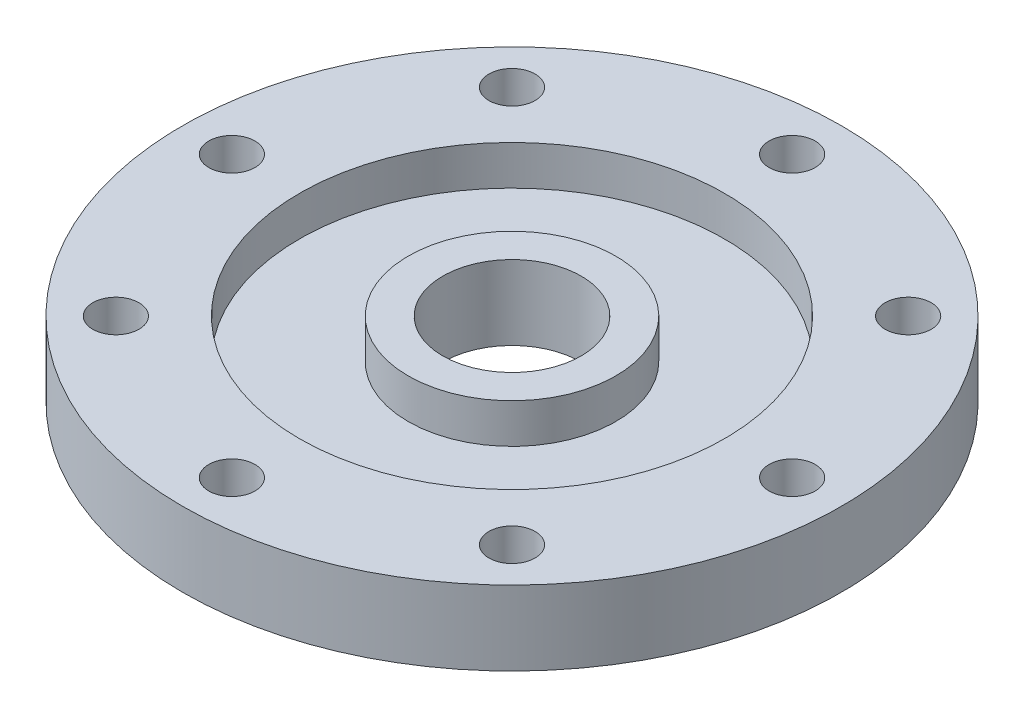
ISO-10303-21;
HEADER;
FILE_DESCRIPTION(('STEP AP214'),'2;1');
FILE_NAME('part.step','',(''),(''),'','','');
FILE_SCHEMA(('AUTOMOTIVE_DESIGN { 1 0 10303 214 1 1 1 1 }'));
ENDSEC;
DATA;
#1=APPLICATION_CONTEXT('core data for automotive mechanical design processes');
#2=APPLICATION_PROTOCOL_DEFINITION('international standard','automotive_design',2000,#1);
#3=PRODUCT_CONTEXT('',#1,'mechanical');
#4=PRODUCT('Part','Part','',(#3));
#5=PRODUCT_RELATED_PRODUCT_CATEGORY('part','',(#4));
#6=PRODUCT_DEFINITION_FORMATION('','',#4);
#7=PRODUCT_DEFINITION_CONTEXT('part definition',#1,'design');
#8=PRODUCT_DEFINITION('design','',#6,#7);
#9=PRODUCT_DEFINITION_SHAPE('','',#8);
#10=(LENGTH_UNIT() NAMED_UNIT(*) SI_UNIT(.MILLI.,.METRE.));
#11=(NAMED_UNIT(*) PLANE_ANGLE_UNIT() SI_UNIT($,.RADIAN.));
#12=(NAMED_UNIT(*) SI_UNIT($,.STERADIAN.) SOLID_ANGLE_UNIT());
#13=UNCERTAINTY_MEASURE_WITH_UNIT(LENGTH_MEASURE(1.E-05),#10,'distance_accuracy_value','');
#14=(GEOMETRIC_REPRESENTATION_CONTEXT(3) GLOBAL_UNCERTAINTY_ASSIGNED_CONTEXT((#13)) GLOBAL_UNIT_ASSIGNED_CONTEXT((#10,
#11,#12)) REPRESENTATION_CONTEXT('',''));
#15=CARTESIAN_POINT('',(0.,0.,0.));
#16=DIRECTION('',(0.,0.,1.));
#17=DIRECTION('',(1.,0.,0.));
#18=AXIS2_PLACEMENT_3D('',#15,#16,#17);
#19=CARTESIAN_POINT('',(0.,2.825,0.));
#20=DIRECTION('',(0.,1.,0.));
#21=DIRECTION('',(0.,0.,1.));
#22=AXIS2_PLACEMENT_3D('',#19,#20,#21);
#23=PLANE('',#22);
#24=CARTESIAN_POINT('',(0.,2.825,0.));
#25=DIRECTION('',(0.,1.,0.));
#26=DIRECTION('',(0.,0.,1.));
#27=AXIS2_PLACEMENT_3D('',#24,#25,#26);
#28=CIRCLE('',#27,5.25);
#29=CARTESIAN_POINT('',(0.,2.825,5.25));
#30=VERTEX_POINT('',#29);
#31=EDGE_CURVE('E44',#30,#30,#28,.T.);
#32=ORIENTED_EDGE('',*,*,#31,.F.);
#33=EDGE_LOOP('',(#32));
#34=FACE_BOUND('',#33,.T.);
#35=CARTESIAN_POINT('',(0.,2.825,0.));
#36=DIRECTION('',(0.,1.,0.));
#37=DIRECTION('',(0.,0.,1.));
#38=AXIS2_PLACEMENT_3D('',#35,#36,#37);
#39=CIRCLE('',#38,7.875);
#40=CARTESIAN_POINT('',(0.,2.825,7.875));
#41=VERTEX_POINT('',#40);
#42=EDGE_CURVE('E106',#41,#41,#39,.T.);
#43=ORIENTED_EDGE('',*,*,#42,.T.);
#44=EDGE_LOOP('',(#43));
#45=FACE_BOUND('',#44,.T.);
#46=ADVANCED_FACE('F33',(#34,#45),#23,.T.);
#47=CARTESIAN_POINT('',(0.,2.825,0.));
#48=DIRECTION('',(0.,1.,0.));
#49=DIRECTION('',(0.,0.,1.));
#50=AXIS2_PLACEMENT_3D('',#47,#48,#49);
#51=CIRCLE('',#50,16.125);
#52=CARTESIAN_POINT('',(0.,2.825,16.125));
#53=VERTEX_POINT('',#52);
#54=EDGE_CURVE('E100',#53,#53,#51,.T.);
#55=ORIENTED_EDGE('',*,*,#54,.F.);
#56=EDGE_LOOP('',(#55));
#57=FACE_BOUND('',#56,.T.);
#58=CARTESIAN_POINT('',(-21.25,2.825,0.));
#59=DIRECTION('',(0.,1.,0.));
#60=DIRECTION('',(0.,0.,1.));
#61=AXIS2_PLACEMENT_3D('',#58,#59,#60);
#62=CIRCLE('',#61,1.75);
#63=CARTESIAN_POINT('',(-21.25,2.825,1.75));
#64=VERTEX_POINT('',#63);
#65=EDGE_CURVE('E85',#64,#64,#62,.T.);
#66=ORIENTED_EDGE('',*,*,#65,.F.);
#67=EDGE_LOOP('',(#66));
#68=FACE_BOUND('',#67,.T.);
#69=CARTESIAN_POINT('',(0.,2.825,21.25));
#70=DIRECTION('',(0.,1.,0.));
#71=DIRECTION('',(0.,0.,1.));
#72=AXIS2_PLACEMENT_3D('',#69,#70,#71);
#73=CIRCLE('',#72,1.75);
#74=CARTESIAN_POINT('',(0.,2.825,23.));
#75=VERTEX_POINT('',#74);
#76=EDGE_CURVE('E73',#75,#75,#73,.T.);
#77=ORIENTED_EDGE('',*,*,#76,.F.);
#78=EDGE_LOOP('',(#77));
#79=FACE_BOUND('',#78,.T.);
#80=CARTESIAN_POINT('',(21.25,2.825,0.));
#81=DIRECTION('',(0.,1.,0.));
#82=DIRECTION('',(0.,0.,1.));
#83=AXIS2_PLACEMENT_3D('',#80,#81,#82);
#84=CIRCLE('',#83,1.75);
#85=CARTESIAN_POINT('',(21.25,2.825,1.75));
#86=VERTEX_POINT('',#85);
#87=EDGE_CURVE('E61',#86,#86,#84,.T.);
#88=ORIENTED_EDGE('',*,*,#87,.F.);
#89=EDGE_LOOP('',(#88));
#90=FACE_BOUND('',#89,.T.);
#91=CARTESIAN_POINT('',(15.0260191002147,2.825,-15.0260191002141));
#92=DIRECTION('',(0.,1.,0.));
#93=DIRECTION('',(0.,0.,1.));
#94=AXIS2_PLACEMENT_3D('',#91,#92,#93);
#95=CIRCLE('',#94,1.75);
#96=CARTESIAN_POINT('',(15.0260191002147,2.825,-13.2760191002141));
#97=VERTEX_POINT('',#96);
#98=EDGE_CURVE('E49',#97,#97,#95,.T.);
#99=ORIENTED_EDGE('',*,*,#98,.F.);
#100=EDGE_LOOP('',(#99));
#101=FACE_BOUND('',#100,.T.);
#102=CARTESIAN_POINT('',(0.,2.825,0.));
#103=DIRECTION('',(0.,1.,0.));
#104=DIRECTION('',(0.,0.,1.));
#105=AXIS2_PLACEMENT_3D('',#102,#103,#104);
#106=CIRCLE('',#105,25.);
#107=CARTESIAN_POINT('',(0.,2.825,25.));
#108=VERTEX_POINT('',#107);
#109=EDGE_CURVE('E10',#108,#108,#106,.T.);
#110=ORIENTED_EDGE('',*,*,#109,.T.);
#111=EDGE_LOOP('',(#110));
#112=FACE_BOUND('',#111,.T.);
#113=CARTESIAN_POINT('',(0.,2.825,-21.25));
#114=DIRECTION('',(0.,1.,0.));
#115=DIRECTION('',(0.,0.,1.));
#116=AXIS2_PLACEMENT_3D('',#113,#114,#115);
#117=CIRCLE('',#116,1.75);
#118=CARTESIAN_POINT('',(0.,2.825,-19.5));
#119=VERTEX_POINT('',#118);
#120=EDGE_CURVE('E55',#119,#119,#117,.T.);
#121=ORIENTED_EDGE('',*,*,#120,.F.);
#122=EDGE_LOOP('',(#121));
#123=FACE_BOUND('',#122,.T.);
#124=CARTESIAN_POINT('',(15.0260191002141,2.825,15.0260191002141));
#125=DIRECTION('',(0.,1.,0.));
#126=DIRECTION('',(0.,0.,1.));
#127=AXIS2_PLACEMENT_3D('',#124,#125,#126);
#128=CIRCLE('',#127,1.75);
#129=CARTESIAN_POINT('',(15.0260191002141,2.825,16.7760191002141));
#130=VERTEX_POINT('',#129);
#131=EDGE_CURVE('E67',#130,#130,#128,.T.);
#132=ORIENTED_EDGE('',*,*,#131,.F.);
#133=EDGE_LOOP('',(#132));
#134=FACE_BOUND('',#133,.T.);
#135=CARTESIAN_POINT('',(-15.0260191002141,2.825,15.0260191002141));
#136=DIRECTION('',(0.,1.,0.));
#137=DIRECTION('',(0.,0.,1.));
#138=AXIS2_PLACEMENT_3D('',#135,#136,#137);
#139=CIRCLE('',#138,1.75);
#140=CARTESIAN_POINT('',(-15.0260191002141,2.825,16.7760191002141));
#141=VERTEX_POINT('',#140);
#142=EDGE_CURVE('E79',#141,#141,#139,.T.);
#143=ORIENTED_EDGE('',*,*,#142,.F.);
#144=EDGE_LOOP('',(#143));
#145=FACE_BOUND('',#144,.T.);
#146=CARTESIAN_POINT('',(-15.0260191002145,2.825,-15.0260191002138));
#147=DIRECTION('',(0.,1.,0.));
#148=DIRECTION('',(0.,0.,1.));
#149=AXIS2_PLACEMENT_3D('',#146,#147,#148);
#150=CIRCLE('',#149,1.75);
#151=CARTESIAN_POINT('',(-15.0260191002145,2.825,-13.2760191002138));
#152=VERTEX_POINT('',#151);
#153=EDGE_CURVE('E91',#152,#152,#150,.T.);
#154=ORIENTED_EDGE('',*,*,#153,.F.);
#155=EDGE_LOOP('',(#154));
#156=FACE_BOUND('',#155,.T.);
#157=ADVANCED_FACE('F128',(#57,#68,#79,#90,#101,#112,#123,#134,#145,#156),#23,.T.);
#158=CARTESIAN_POINT('',(0.,-2.825,0.));
#159=DIRECTION('',(0.,1.,0.));
#160=DIRECTION('',(0.,0.,1.));
#161=AXIS2_PLACEMENT_3D('',#158,#159,#160);
#162=PLANE('',#161);
#163=CARTESIAN_POINT('',(0.,-2.825,0.));
#164=DIRECTION('',(0.,1.,0.));
#165=DIRECTION('',(0.,0.,1.));
#166=AXIS2_PLACEMENT_3D('',#163,#164,#165);
#167=CIRCLE('',#166,25.);
#168=CARTESIAN_POINT('',(0.,-2.825,25.));
#169=VERTEX_POINT('',#168);
#170=EDGE_CURVE('E37',#169,#169,#167,.T.);
#171=ORIENTED_EDGE('',*,*,#170,.F.);
#172=EDGE_LOOP('',(#171));
#173=FACE_BOUND('',#172,.T.);
#174=CARTESIAN_POINT('',(0.,-2.825,0.));
#175=DIRECTION('',(0.,1.,0.));
#176=DIRECTION('',(0.,0.,1.));
#177=AXIS2_PLACEMENT_3D('',#174,#175,#176);
#178=CIRCLE('',#177,5.25);
#179=CARTESIAN_POINT('',(0.,-2.825,5.25));
#180=VERTEX_POINT('',#179);
#181=EDGE_CURVE('E46',#180,#180,#178,.T.);
#182=ORIENTED_EDGE('',*,*,#181,.T.);
#183=EDGE_LOOP('',(#182));
#184=FACE_BOUND('',#183,.T.);
#185=CARTESIAN_POINT('',(15.0260191002147,-2.825,-15.0260191002141));
#186=DIRECTION('',(0.,1.,0.));
#187=DIRECTION('',(0.,0.,1.));
#188=AXIS2_PLACEMENT_3D('',#185,#186,#187);
#189=CIRCLE('',#188,1.75);
#190=CARTESIAN_POINT('',(15.0260191002147,-2.825,-13.2760191002141));
#191=VERTEX_POINT('',#190);
#192=EDGE_CURVE('E52',#191,#191,#189,.T.);
#193=ORIENTED_EDGE('',*,*,#192,.T.);
#194=EDGE_LOOP('',(#193));
#195=FACE_BOUND('',#194,.T.);
#196=CARTESIAN_POINT('',(0.,-2.825,-21.25));
#197=DIRECTION('',(0.,1.,0.));
#198=DIRECTION('',(0.,0.,1.));
#199=AXIS2_PLACEMENT_3D('',#196,#197,#198);
#200=CIRCLE('',#199,1.75);
#201=CARTESIAN_POINT('',(0.,-2.825,-19.5));
#202=VERTEX_POINT('',#201);
#203=EDGE_CURVE('E58',#202,#202,#200,.T.);
#204=ORIENTED_EDGE('',*,*,#203,.T.);
#205=EDGE_LOOP('',(#204));
#206=FACE_BOUND('',#205,.T.);
#207=CARTESIAN_POINT('',(21.25,-2.825,0.));
#208=DIRECTION('',(0.,1.,0.));
#209=DIRECTION('',(0.,0.,1.));
#210=AXIS2_PLACEMENT_3D('',#207,#208,#209);
#211=CIRCLE('',#210,1.75);
#212=CARTESIAN_POINT('',(21.25,-2.825,1.75));
#213=VERTEX_POINT('',#212);
#214=EDGE_CURVE('E64',#213,#213,#211,.T.);
#215=ORIENTED_EDGE('',*,*,#214,.T.);
#216=EDGE_LOOP('',(#215));
#217=FACE_BOUND('',#216,.T.);
#218=CARTESIAN_POINT('',(15.0260191002141,-2.825,15.0260191002141));
#219=DIRECTION('',(0.,1.,0.));
#220=DIRECTION('',(0.,0.,1.));
#221=AXIS2_PLACEMENT_3D('',#218,#219,#220);
#222=CIRCLE('',#221,1.75);
#223=CARTESIAN_POINT('',(15.0260191002141,-2.825,16.7760191002141));
#224=VERTEX_POINT('',#223);
#225=EDGE_CURVE('E70',#224,#224,#222,.T.);
#226=ORIENTED_EDGE('',*,*,#225,.T.);
#227=EDGE_LOOP('',(#226));
#228=FACE_BOUND('',#227,.T.);
#229=CARTESIAN_POINT('',(0.,-2.825,21.25));
#230=DIRECTION('',(0.,1.,0.));
#231=DIRECTION('',(0.,0.,1.));
#232=AXIS2_PLACEMENT_3D('',#229,#230,#231);
#233=CIRCLE('',#232,1.75);
#234=CARTESIAN_POINT('',(0.,-2.825,23.));
#235=VERTEX_POINT('',#234);
#236=EDGE_CURVE('E76',#235,#235,#233,.T.);
#237=ORIENTED_EDGE('',*,*,#236,.T.);
#238=EDGE_LOOP('',(#237));
#239=FACE_BOUND('',#238,.T.);
#240=CARTESIAN_POINT('',(-15.0260191002141,-2.825,15.0260191002141));
#241=DIRECTION('',(0.,1.,0.));
#242=DIRECTION('',(0.,0.,1.));
#243=AXIS2_PLACEMENT_3D('',#240,#241,#242);
#244=CIRCLE('',#243,1.75);
#245=CARTESIAN_POINT('',(-15.0260191002141,-2.825,16.7760191002141));
#246=VERTEX_POINT('',#245);
#247=EDGE_CURVE('E82',#246,#246,#244,.T.);
#248=ORIENTED_EDGE('',*,*,#247,.T.);
#249=EDGE_LOOP('',(#248));
#250=FACE_BOUND('',#249,.T.);
#251=CARTESIAN_POINT('',(-21.25,-2.825,0.));
#252=DIRECTION('',(0.,1.,0.));
#253=DIRECTION('',(0.,0.,1.));
#254=AXIS2_PLACEMENT_3D('',#251,#252,#253);
#255=CIRCLE('',#254,1.75);
#256=CARTESIAN_POINT('',(-21.25,-2.825,1.75));
#257=VERTEX_POINT('',#256);
#258=EDGE_CURVE('E88',#257,#257,#255,.T.);
#259=ORIENTED_EDGE('',*,*,#258,.T.);
#260=EDGE_LOOP('',(#259));
#261=FACE_BOUND('',#260,.T.);
#262=CARTESIAN_POINT('',(-15.0260191002145,-2.825,-15.0260191002138));
#263=DIRECTION('',(0.,1.,0.));
#264=DIRECTION('',(0.,0.,1.));
#265=AXIS2_PLACEMENT_3D('',#262,#263,#264);
#266=CIRCLE('',#265,1.75);
#267=CARTESIAN_POINT('',(-15.0260191002145,-2.825,-13.2760191002138));
#268=VERTEX_POINT('',#267);
#269=EDGE_CURVE('E94',#268,#268,#266,.T.);
#270=ORIENTED_EDGE('',*,*,#269,.T.);
#271=EDGE_LOOP('',(#270));
#272=FACE_BOUND('',#271,.T.);
#273=ADVANCED_FACE('F131',(#173,#184,#195,#206,#217,#228,#239,#250,#261,#272),#162,.F.);
#274=CARTESIAN_POINT('',(0.,2.825,0.));
#275=DIRECTION('',(0.,-1.,0.));
#276=DIRECTION('',(0.,0.,-1.));
#277=AXIS2_PLACEMENT_3D('',#274,#275,#276);
#278=CYLINDRICAL_SURFACE('',#277,25.);
#279=ORIENTED_EDGE('',*,*,#109,.F.);
#280=EDGE_LOOP('',(#279));
#281=FACE_BOUND('',#280,.T.);
#282=ORIENTED_EDGE('',*,*,#170,.T.);
#283=EDGE_LOOP('',(#282));
#284=FACE_BOUND('',#283,.T.);
#285=ADVANCED_FACE('F35',(#281,#284),#278,.T.);
#286=CARTESIAN_POINT('',(0.,2.825,0.));
#287=DIRECTION('',(0.,-1.,0.));
#288=DIRECTION('',(0.,0.,-1.));
#289=AXIS2_PLACEMENT_3D('',#286,#287,#288);
#290=CYLINDRICAL_SURFACE('',#289,5.25);
#291=ORIENTED_EDGE('',*,*,#31,.T.);
#292=EDGE_LOOP('',(#291));
#293=FACE_BOUND('',#292,.T.);
#294=ORIENTED_EDGE('',*,*,#181,.F.);
#295=EDGE_LOOP('',(#294));
#296=FACE_BOUND('',#295,.T.);
#297=ADVANCED_FACE('F160',(#293,#296),#290,.F.);
#298=CARTESIAN_POINT('',(15.0260191002147,2.825,-15.0260191002141));
#299=DIRECTION('',(0.,-1.,0.));
#300=DIRECTION('',(0.,0.,-1.));
#301=AXIS2_PLACEMENT_3D('',#298,#299,#300);
#302=CYLINDRICAL_SURFACE('',#301,1.75);
#303=ORIENTED_EDGE('',*,*,#98,.T.);
#304=EDGE_LOOP('',(#303));
#305=FACE_BOUND('',#304,.T.);
#306=ORIENTED_EDGE('',*,*,#192,.F.);
#307=EDGE_LOOP('',(#306));
#308=FACE_BOUND('',#307,.T.);
#309=ADVANCED_FACE('F173',(#305,#308),#302,.F.);
#310=CARTESIAN_POINT('',(0.,2.825,-21.25));
#311=DIRECTION('',(0.,-1.,0.));
#312=DIRECTION('',(0.,0.,-1.));
#313=AXIS2_PLACEMENT_3D('',#310,#311,#312);
#314=CYLINDRICAL_SURFACE('',#313,1.75);
#315=ORIENTED_EDGE('',*,*,#120,.T.);
#316=EDGE_LOOP('',(#315));
#317=FACE_BOUND('',#316,.T.);
#318=ORIENTED_EDGE('',*,*,#203,.F.);
#319=EDGE_LOOP('',(#318));
#320=FACE_BOUND('',#319,.T.);
#321=ADVANCED_FACE('F177',(#317,#320),#314,.F.);
#322=CARTESIAN_POINT('',(21.25,2.825,0.));
#323=DIRECTION('',(0.,-1.,0.));
#324=DIRECTION('',(0.,0.,-1.));
#325=AXIS2_PLACEMENT_3D('',#322,#323,#324);
#326=CYLINDRICAL_SURFACE('',#325,1.75);
#327=ORIENTED_EDGE('',*,*,#87,.T.);
#328=EDGE_LOOP('',(#327));
#329=FACE_BOUND('',#328,.T.);
#330=ORIENTED_EDGE('',*,*,#214,.F.);
#331=EDGE_LOOP('',(#330));
#332=FACE_BOUND('',#331,.T.);
#333=ADVANCED_FACE('F181',(#329,#332),#326,.F.);
#334=CARTESIAN_POINT('',(15.0260191002141,2.825,15.0260191002141));
#335=DIRECTION('',(0.,-1.,0.));
#336=DIRECTION('',(0.,0.,-1.));
#337=AXIS2_PLACEMENT_3D('',#334,#335,#336);
#338=CYLINDRICAL_SURFACE('',#337,1.75);
#339=ORIENTED_EDGE('',*,*,#131,.T.);
#340=EDGE_LOOP('',(#339));
#341=FACE_BOUND('',#340,.T.);
#342=ORIENTED_EDGE('',*,*,#225,.F.);
#343=EDGE_LOOP('',(#342));
#344=FACE_BOUND('',#343,.T.);
#345=ADVANCED_FACE('F185',(#341,#344),#338,.F.);
#346=CARTESIAN_POINT('',(0.,2.825,21.25));
#347=DIRECTION('',(0.,-1.,0.));
#348=DIRECTION('',(0.,0.,-1.));
#349=AXIS2_PLACEMENT_3D('',#346,#347,#348);
#350=CYLINDRICAL_SURFACE('',#349,1.75);
#351=ORIENTED_EDGE('',*,*,#76,.T.);
#352=EDGE_LOOP('',(#351));
#353=FACE_BOUND('',#352,.T.);
#354=ORIENTED_EDGE('',*,*,#236,.F.);
#355=EDGE_LOOP('',(#354));
#356=FACE_BOUND('',#355,.T.);
#357=ADVANCED_FACE('F189',(#353,#356),#350,.F.);
#358=CARTESIAN_POINT('',(-15.0260191002141,2.825,15.0260191002141));
#359=DIRECTION('',(0.,-1.,0.));
#360=DIRECTION('',(0.,0.,-1.));
#361=AXIS2_PLACEMENT_3D('',#358,#359,#360);
#362=CYLINDRICAL_SURFACE('',#361,1.75);
#363=ORIENTED_EDGE('',*,*,#142,.T.);
#364=EDGE_LOOP('',(#363));
#365=FACE_BOUND('',#364,.T.);
#366=ORIENTED_EDGE('',*,*,#247,.F.);
#367=EDGE_LOOP('',(#366));
#368=FACE_BOUND('',#367,.T.);
#369=ADVANCED_FACE('F193',(#365,#368),#362,.F.);
#370=CARTESIAN_POINT('',(-21.25,2.825,0.));
#371=DIRECTION('',(0.,-1.,0.));
#372=DIRECTION('',(0.,0.,-1.));
#373=AXIS2_PLACEMENT_3D('',#370,#371,#372);
#374=CYLINDRICAL_SURFACE('',#373,1.75);
#375=ORIENTED_EDGE('',*,*,#65,.T.);
#376=EDGE_LOOP('',(#375));
#377=FACE_BOUND('',#376,.T.);
#378=ORIENTED_EDGE('',*,*,#258,.F.);
#379=EDGE_LOOP('',(#378));
#380=FACE_BOUND('',#379,.T.);
#381=ADVANCED_FACE('F151',(#377,#380),#374,.F.);
#382=CARTESIAN_POINT('',(-15.0260191002145,2.825,-15.0260191002138));
#383=DIRECTION('',(0.,-1.,0.));
#384=DIRECTION('',(0.,0.,-1.));
#385=AXIS2_PLACEMENT_3D('',#382,#383,#384);
#386=CYLINDRICAL_SURFACE('',#385,1.75);
#387=ORIENTED_EDGE('',*,*,#153,.T.);
#388=EDGE_LOOP('',(#387));
#389=FACE_BOUND('',#388,.T.);
#390=ORIENTED_EDGE('',*,*,#269,.F.);
#391=EDGE_LOOP('',(#390));
#392=FACE_BOUND('',#391,.T.);
#393=ADVANCED_FACE('F124',(#389,#392),#386,.F.);
#394=CARTESIAN_POINT('',(0.,-0.175,0.));
#395=DIRECTION('',(0.,1.,0.));
#396=DIRECTION('',(0.,0.,1.));
#397=AXIS2_PLACEMENT_3D('',#394,#395,#396);
#398=CYLINDRICAL_SURFACE('',#397,16.125);
#399=CARTESIAN_POINT('',(0.,-0.175,0.));
#400=DIRECTION('',(0.,1.,0.));
#401=DIRECTION('',(0.,0.,1.));
#402=AXIS2_PLACEMENT_3D('',#399,#400,#401);
#403=CIRCLE('',#402,16.125);
#404=CARTESIAN_POINT('',(0.,-0.175,16.125));
#405=VERTEX_POINT('',#404);
#406=EDGE_CURVE('E97',#405,#405,#403,.T.);
#407=ORIENTED_EDGE('',*,*,#406,.F.);
#408=EDGE_LOOP('',(#407));
#409=FACE_BOUND('',#408,.T.);
#410=ORIENTED_EDGE('',*,*,#54,.T.);
#411=EDGE_LOOP('',(#410));
#412=FACE_BOUND('',#411,.T.);
#413=ADVANCED_FACE('F118',(#409,#412),#398,.F.);
#414=CARTESIAN_POINT('',(0.,-0.175,0.));
#415=DIRECTION('',(0.,1.,0.));
#416=DIRECTION('',(0.,0.,1.));
#417=AXIS2_PLACEMENT_3D('',#414,#415,#416);
#418=PLANE('',#417);
#419=CARTESIAN_POINT('',(0.,-0.175,0.));
#420=DIRECTION('',(0.,1.,0.));
#421=DIRECTION('',(0.,0.,1.));
#422=AXIS2_PLACEMENT_3D('',#419,#420,#421);
#423=CIRCLE('',#422,7.875);
#424=CARTESIAN_POINT('',(0.,-0.175,7.875));
#425=VERTEX_POINT('',#424);
#426=EDGE_CURVE('E103',#425,#425,#423,.T.);
#427=ORIENTED_EDGE('',*,*,#426,.F.);
#428=EDGE_LOOP('',(#427));
#429=FACE_BOUND('',#428,.T.);
#430=ORIENTED_EDGE('',*,*,#406,.T.);
#431=EDGE_LOOP('',(#430));
#432=FACE_BOUND('',#431,.T.);
#433=ADVANCED_FACE('F115',(#429,#432),#418,.T.);
#434=CARTESIAN_POINT('',(0.,-0.175,0.));
#435=DIRECTION('',(0.,1.,0.));
#436=DIRECTION('',(0.,0.,1.));
#437=AXIS2_PLACEMENT_3D('',#434,#435,#436);
#438=CYLINDRICAL_SURFACE('',#437,7.875);
#439=ORIENTED_EDGE('',*,*,#426,.T.);
#440=EDGE_LOOP('',(#439));
#441=FACE_BOUND('',#440,.T.);
#442=ORIENTED_EDGE('',*,*,#42,.F.);
#443=EDGE_LOOP('',(#442));
#444=FACE_BOUND('',#443,.T.);
#445=ADVANCED_FACE('F112',(#441,#444),#438,.T.);
#446=CLOSED_SHELL('',(#46,#157,#273,#285,#297,#309,#321,#333,#345,#357,#369,#381,#393,#413,#433,#445));
#447=MANIFOLD_SOLID_BREP('B2',#446);
#448=ADVANCED_BREP_SHAPE_REPRESENTATION('',(#18,#447),#14);
#449=SHAPE_DEFINITION_REPRESENTATION(#9,#448);
ENDSEC;
END-ISO-10303-21;
